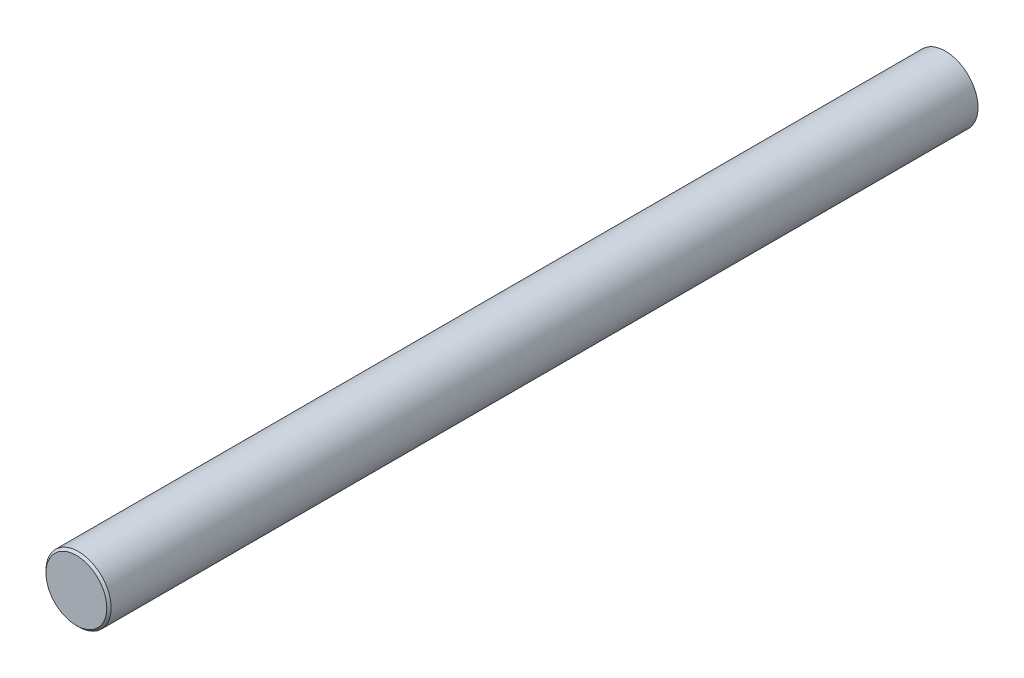
ISO-10303-21;
HEADER;
FILE_DESCRIPTION(('STEP AP214'),'2;1');
FILE_NAME('part.step','',(''),(''),'','','');
FILE_SCHEMA(('AUTOMOTIVE_DESIGN { 1 0 10303 214 1 1 1 1 }'));
ENDSEC;
DATA;
#1=APPLICATION_CONTEXT('core data for automotive mechanical design processes');
#2=APPLICATION_PROTOCOL_DEFINITION('international standard','automotive_design',2000,#1);
#3=PRODUCT_CONTEXT('',#1,'mechanical');
#4=PRODUCT('Part','Part','',(#3));
#5=PRODUCT_RELATED_PRODUCT_CATEGORY('part','',(#4));
#6=PRODUCT_DEFINITION_FORMATION('','',#4);
#7=PRODUCT_DEFINITION_CONTEXT('part definition',#1,'design');
#8=PRODUCT_DEFINITION('design','',#6,#7);
#9=PRODUCT_DEFINITION_SHAPE('','',#8);
#10=(LENGTH_UNIT() NAMED_UNIT(*) SI_UNIT(.MILLI.,.METRE.));
#11=(NAMED_UNIT(*) PLANE_ANGLE_UNIT() SI_UNIT($,.RADIAN.));
#12=(NAMED_UNIT(*) SI_UNIT($,.STERADIAN.) SOLID_ANGLE_UNIT());
#13=UNCERTAINTY_MEASURE_WITH_UNIT(LENGTH_MEASURE(1.E-05),#10,'distance_accuracy_value','');
#14=(GEOMETRIC_REPRESENTATION_CONTEXT(3) GLOBAL_UNCERTAINTY_ASSIGNED_CONTEXT((#13)) GLOBAL_UNIT_ASSIGNED_CONTEXT((#10,
#11,#12)) REPRESENTATION_CONTEXT('',''));
#15=CARTESIAN_POINT('',(0.,0.,0.));
#16=DIRECTION('',(0.,0.,1.));
#17=DIRECTION('',(1.,0.,0.));
#18=AXIS2_PLACEMENT_3D('',#15,#16,#17);
#19=CARTESIAN_POINT('',(-8.88178419700125E-13,0.,400.));
#20=DIRECTION('',(0.,0.,-1.));
#21=DIRECTION('',(-1.,0.,0.));
#22=AXIS2_PLACEMENT_3D('',#19,#20,#21);
#23=CYLINDRICAL_SURFACE('',#22,15.);
#24=CARTESIAN_POINT('',(-8.88178419700125E-13,0.,399.));
#25=DIRECTION('',(0.,0.,1.));
#26=DIRECTION('',(1.,0.,0.));
#27=AXIS2_PLACEMENT_3D('',#24,#25,#26);
#28=CIRCLE('',#27,15.);
#29=CARTESIAN_POINT('',(14.9999999999991,0.,399.));
#30=VERTEX_POINT('',#29);
#31=EDGE_CURVE('E10',#30,#30,#28,.F.);
#32=ORIENTED_EDGE('',*,*,#31,.T.);
#33=EDGE_LOOP('',(#32));
#34=FACE_BOUND('',#33,.T.);
#35=CARTESIAN_POINT('',(0.,0.,0.));
#36=DIRECTION('',(0.,0.,1.));
#37=DIRECTION('',(1.,0.,0.));
#38=AXIS2_PLACEMENT_3D('',#35,#36,#37);
#39=CIRCLE('',#38,15.);
#40=CARTESIAN_POINT('',(15.,0.,0.));
#41=VERTEX_POINT('',#40);
#42=EDGE_CURVE('E40',#41,#41,#39,.T.);
#43=ORIENTED_EDGE('',*,*,#42,.T.);
#44=EDGE_LOOP('',(#43));
#45=FACE_BOUND('',#44,.T.);
#46=ADVANCED_FACE('F30',(#34,#45),#23,.T.);
#47=CARTESIAN_POINT('',(-8.88178419700125E-13,0.,400.));
#48=DIRECTION('',(0.,0.,1.));
#49=DIRECTION('',(1.,0.,0.));
#50=AXIS2_PLACEMENT_3D('',#47,#48,#49);
#51=PLANE('',#50);
#52=CARTESIAN_POINT('',(-8.88178419700125E-13,0.,400.));
#53=DIRECTION('',(0.,0.,1.));
#54=DIRECTION('',(1.,0.,0.));
#55=AXIS2_PLACEMENT_3D('',#52,#53,#54);
#56=CIRCLE('',#55,14.);
#57=CARTESIAN_POINT('',(13.9999999999991,0.,400.));
#58=VERTEX_POINT('',#57);
#59=EDGE_CURVE('E36',#58,#58,#56,.T.);
#60=ORIENTED_EDGE('',*,*,#59,.T.);
#61=EDGE_LOOP('',(#60));
#62=FACE_BOUND('',#61,.T.);
#63=ADVANCED_FACE('F51',(#62),#51,.T.);
#64=CARTESIAN_POINT('',(0.,0.,0.));
#65=DIRECTION('',(0.,0.,1.));
#66=DIRECTION('',(1.,0.,0.));
#67=AXIS2_PLACEMENT_3D('',#64,#65,#66);
#68=PLANE('',#67);
#69=ORIENTED_EDGE('',*,*,#42,.F.);
#70=EDGE_LOOP('',(#69));
#71=FACE_BOUND('',#70,.T.);
#72=ADVANCED_FACE('F48',(#71),#68,.F.);
#73=CARTESIAN_POINT('',(-8.88178419700125E-13,0.,400.));
#74=DIRECTION('',(0.,0.,-1.));
#75=DIRECTION('',(-1.,0.,0.));
#76=AXIS2_PLACEMENT_3D('',#73,#74,#75);
#77=CONICAL_SURFACE('',#76,14.,0.785398163397457);
#78=ORIENTED_EDGE('',*,*,#31,.F.);
#79=EDGE_LOOP('',(#78));
#80=FACE_BOUND('',#79,.T.);
#81=ORIENTED_EDGE('',*,*,#59,.F.);
#82=EDGE_LOOP('',(#81));
#83=FACE_BOUND('',#82,.T.);
#84=ADVANCED_FACE('F50',(#80,#83),#77,.T.);
#85=CLOSED_SHELL('',(#46,#63,#72,#84));
#86=MANIFOLD_SOLID_BREP('B2',#85);
#87=ADVANCED_BREP_SHAPE_REPRESENTATION('',(#18,#86),#14);
#88=SHAPE_DEFINITION_REPRESENTATION(#9,#87);
ENDSEC;
END-ISO-10303-21;
